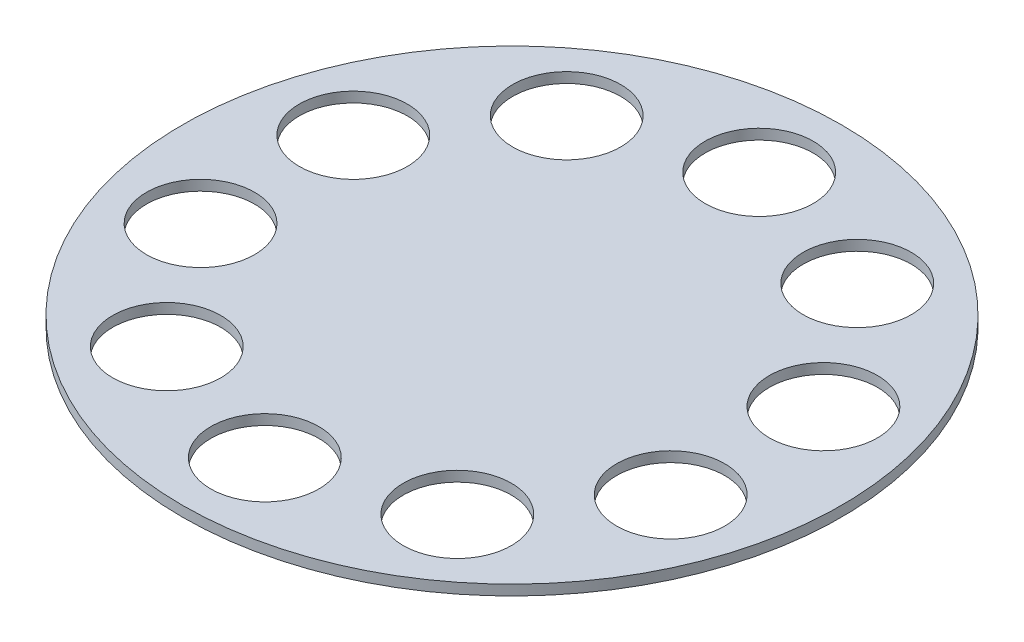
ISO-10303-21;
HEADER;
FILE_DESCRIPTION(('STEP AP214'),'2;1');
FILE_NAME('part.step','',(''),(''),'','','');
FILE_SCHEMA(('AUTOMOTIVE_DESIGN { 1 0 10303 214 1 1 1 1 }'));
ENDSEC;
DATA;
#1=APPLICATION_CONTEXT('core data for automotive mechanical design processes');
#2=APPLICATION_PROTOCOL_DEFINITION('international standard','automotive_design',2000,#1);
#3=PRODUCT_CONTEXT('',#1,'mechanical');
#4=PRODUCT('Part','Part','',(#3));
#5=PRODUCT_RELATED_PRODUCT_CATEGORY('part','',(#4));
#6=PRODUCT_DEFINITION_FORMATION('','',#4);
#7=PRODUCT_DEFINITION_CONTEXT('part definition',#1,'design');
#8=PRODUCT_DEFINITION('design','',#6,#7);
#9=PRODUCT_DEFINITION_SHAPE('','',#8);
#10=(LENGTH_UNIT() NAMED_UNIT(*) SI_UNIT(.MILLI.,.METRE.));
#11=(NAMED_UNIT(*) PLANE_ANGLE_UNIT() SI_UNIT($,.RADIAN.));
#12=(NAMED_UNIT(*) SI_UNIT($,.STERADIAN.) SOLID_ANGLE_UNIT());
#13=UNCERTAINTY_MEASURE_WITH_UNIT(LENGTH_MEASURE(1.E-05),#10,'distance_accuracy_value','');
#14=(GEOMETRIC_REPRESENTATION_CONTEXT(3) GLOBAL_UNCERTAINTY_ASSIGNED_CONTEXT((#13)) GLOBAL_UNIT_ASSIGNED_CONTEXT((#10,
#11,#12)) REPRESENTATION_CONTEXT('',''));
#15=CARTESIAN_POINT('',(0.,0.,0.));
#16=DIRECTION('',(0.,0.,1.));
#17=DIRECTION('',(1.,0.,0.));
#18=AXIS2_PLACEMENT_3D('',#15,#16,#17);
#19=CARTESIAN_POINT('',(0.,6.35,0.));
#20=DIRECTION('',(0.,-1.,0.));
#21=DIRECTION('',(0.,0.,-1.));
#22=AXIS2_PLACEMENT_3D('',#19,#20,#21);
#23=CYLINDRICAL_SURFACE('',#22,203.2);
#24=CARTESIAN_POINT('',(0.,6.35,0.));
#25=DIRECTION('',(0.,1.,0.));
#26=DIRECTION('',(0.,0.,1.));
#27=AXIS2_PLACEMENT_3D('',#24,#25,#26);
#28=CIRCLE('',#27,203.2);
#29=CARTESIAN_POINT('',(0.,6.35,203.2));
#30=VERTEX_POINT('',#29);
#31=EDGE_CURVE('E10',#30,#30,#28,.T.);
#32=ORIENTED_EDGE('',*,*,#31,.F.);
#33=EDGE_LOOP('',(#32));
#34=FACE_BOUND('',#33,.T.);
#35=CARTESIAN_POINT('',(0.,0.,0.));
#36=DIRECTION('',(0.,1.,0.));
#37=DIRECTION('',(0.,0.,1.));
#38=AXIS2_PLACEMENT_3D('',#35,#36,#37);
#39=CIRCLE('',#38,203.2);
#40=CARTESIAN_POINT('',(0.,0.,203.2));
#41=VERTEX_POINT('',#40);
#42=EDGE_CURVE('E34',#41,#41,#39,.T.);
#43=ORIENTED_EDGE('',*,*,#42,.T.);
#44=EDGE_LOOP('',(#43));
#45=FACE_BOUND('',#44,.T.);
#46=ADVANCED_FACE('F31',(#34,#45),#23,.T.);
#47=CARTESIAN_POINT('',(0.,6.35,0.));
#48=DIRECTION('',(0.,1.,0.));
#49=DIRECTION('',(0.,0.,1.));
#50=AXIS2_PLACEMENT_3D('',#47,#48,#49);
#51=PLANE('',#50);
#52=CARTESIAN_POINT('',(-89.5784724493715,6.35,-123.294189942738));
#53=DIRECTION('',(0.,1.,0.));
#54=DIRECTION('',(0.,0.,1.));
#55=AXIS2_PLACEMENT_3D('',#52,#53,#54);
#56=CIRCLE('',#55,33.3375);
#57=CARTESIAN_POINT('',(-89.5784724493715,6.35,-89.9566899427375));
#58=VERTEX_POINT('',#57);
#59=EDGE_CURVE('E97',#58,#58,#56,.T.);
#60=ORIENTED_EDGE('',*,*,#59,.F.);
#61=EDGE_LOOP('',(#60));
#62=FACE_BOUND('',#61,.T.);
#63=CARTESIAN_POINT('',(-144.941013083376,6.35,-47.0941899427348));
#64=DIRECTION('',(0.,1.,0.));
#65=DIRECTION('',(0.,0.,1.));
#66=AXIS2_PLACEMENT_3D('',#63,#64,#65);
#67=CIRCLE('',#66,33.3375);
#68=CARTESIAN_POINT('',(-144.941013083376,6.35,-13.7566899427348));
#69=VERTEX_POINT('',#68);
#70=EDGE_CURVE('E91',#69,#69,#67,.T.);
#71=ORIENTED_EDGE('',*,*,#70,.F.);
#72=EDGE_LOOP('',(#71));
#73=FACE_BOUND('',#72,.T.);
#74=CARTESIAN_POINT('',(-144.941013083372,6.35,47.0941899427492));
#75=DIRECTION('',(0.,1.,0.));
#76=DIRECTION('',(0.,0.,1.));
#77=AXIS2_PLACEMENT_3D('',#74,#75,#76);
#78=CIRCLE('',#77,33.3375);
#79=CARTESIAN_POINT('',(-144.941013083372,6.35,80.4316899427492));
#80=VERTEX_POINT('',#79);
#81=EDGE_CURVE('E85',#80,#80,#78,.T.);
#82=ORIENTED_EDGE('',*,*,#81,.F.);
#83=EDGE_LOOP('',(#82));
#84=FACE_BOUND('',#83,.T.);
#85=CARTESIAN_POINT('',(-89.5784724493593,6.35,123.294189942746));
#86=DIRECTION('',(0.,1.,0.));
#87=DIRECTION('',(0.,0.,1.));
#88=AXIS2_PLACEMENT_3D('',#85,#86,#87);
#89=CIRCLE('',#88,33.3375);
#90=CARTESIAN_POINT('',(-89.5784724493593,6.35,156.631689942746));
#91=VERTEX_POINT('',#90);
#92=EDGE_CURVE('E79',#91,#91,#89,.T.);
#93=ORIENTED_EDGE('',*,*,#92,.F.);
#94=EDGE_LOOP('',(#93));
#95=FACE_BOUND('',#94,.T.);
#96=CARTESIAN_POINT('',(1.511348076713E-11,6.35,152.4));
#97=DIRECTION('',(0.,1.,0.));
#98=DIRECTION('',(0.,0.,1.));
#99=AXIS2_PLACEMENT_3D('',#96,#97,#98);
#100=CIRCLE('',#99,33.3375);
#101=CARTESIAN_POINT('',(1.511348076713E-11,6.35,185.7375));
#102=VERTEX_POINT('',#101);
#103=EDGE_CURVE('E73',#102,#102,#100,.T.);
#104=ORIENTED_EDGE('',*,*,#103,.F.);
#105=EDGE_LOOP('',(#104));
#106=FACE_BOUND('',#105,.T.);
#107=CARTESIAN_POINT('',(89.5784724493866,6.35,123.294189942738));
#108=DIRECTION('',(0.,1.,0.));
#109=DIRECTION('',(0.,0.,1.));
#110=AXIS2_PLACEMENT_3D('',#107,#108,#109);
#111=CIRCLE('',#110,33.3375);
#112=CARTESIAN_POINT('',(89.5784724493866,6.35,156.631689942738));
#113=VERTEX_POINT('',#112);
#114=EDGE_CURVE('E67',#113,#113,#111,.T.);
#115=ORIENTED_EDGE('',*,*,#114,.F.);
#116=EDGE_LOOP('',(#115));
#117=FACE_BOUND('',#116,.T.);
#118=CARTESIAN_POINT('',(144.941013083391,6.35,47.0941899427348));
#119=DIRECTION('',(0.,1.,0.));
#120=DIRECTION('',(0.,0.,1.));
#121=AXIS2_PLACEMENT_3D('',#118,#119,#120);
#122=CIRCLE('',#121,33.3375);
#123=CARTESIAN_POINT('',(144.941013083391,6.35,80.4316899427348));
#124=VERTEX_POINT('',#123);
#125=EDGE_CURVE('E61',#124,#124,#122,.T.);
#126=ORIENTED_EDGE('',*,*,#125,.F.);
#127=EDGE_LOOP('',(#126));
#128=FACE_BOUND('',#127,.T.);
#129=CARTESIAN_POINT('',(144.941013083387,6.35,-47.0941899427492));
#130=DIRECTION('',(0.,1.,0.));
#131=DIRECTION('',(0.,0.,1.));
#132=AXIS2_PLACEMENT_3D('',#129,#130,#131);
#133=CIRCLE('',#132,33.3375);
#134=CARTESIAN_POINT('',(144.941013083387,6.35,-13.7566899427492));
#135=VERTEX_POINT('',#134);
#136=EDGE_CURVE('E55',#135,#135,#133,.T.);
#137=ORIENTED_EDGE('',*,*,#136,.F.);
#138=EDGE_LOOP('',(#137));
#139=FACE_BOUND('',#138,.T.);
#140=CARTESIAN_POINT('',(89.5784724493744,6.35,-123.294189942746));
#141=DIRECTION('',(0.,1.,0.));
#142=DIRECTION('',(0.,0.,1.));
#143=AXIS2_PLACEMENT_3D('',#140,#141,#142);
#144=CIRCLE('',#143,33.3375);
#145=CARTESIAN_POINT('',(89.5784724493744,6.35,-89.9566899427464));
#146=VERTEX_POINT('',#145);
#147=EDGE_CURVE('E49',#146,#146,#144,.T.);
#148=ORIENTED_EDGE('',*,*,#147,.F.);
#149=EDGE_LOOP('',(#148));
#150=FACE_BOUND('',#149,.T.);
#151=CARTESIAN_POINT('',(0.,6.35,-152.4));
#152=DIRECTION('',(0.,1.,0.));
#153=DIRECTION('',(0.,0.,1.));
#154=AXIS2_PLACEMENT_3D('',#151,#152,#153);
#155=CIRCLE('',#154,33.3375);
#156=CARTESIAN_POINT('',(0.,6.35,-119.0625));
#157=VERTEX_POINT('',#156);
#158=EDGE_CURVE('E43',#157,#157,#155,.T.);
#159=ORIENTED_EDGE('',*,*,#158,.F.);
#160=EDGE_LOOP('',(#159));
#161=FACE_BOUND('',#160,.T.);
#162=ORIENTED_EDGE('',*,*,#31,.T.);
#163=EDGE_LOOP('',(#162));
#164=FACE_BOUND('',#163,.T.);
#165=ADVANCED_FACE('F113',(#62,#73,#84,#95,#106,#117,#128,#139,#150,#161,#164),#51,.T.);
#166=CARTESIAN_POINT('',(0.,0.,0.));
#167=DIRECTION('',(0.,1.,0.));
#168=DIRECTION('',(0.,0.,1.));
#169=AXIS2_PLACEMENT_3D('',#166,#167,#168);
#170=PLANE('',#169);
#171=CARTESIAN_POINT('',(-89.5784724493715,0.,-123.294189942738));
#172=DIRECTION('',(0.,1.,0.));
#173=DIRECTION('',(0.,0.,1.));
#174=AXIS2_PLACEMENT_3D('',#171,#172,#173);
#175=CIRCLE('',#174,33.3375);
#176=CARTESIAN_POINT('',(-89.5784724493715,0.,-89.9566899427375));
#177=VERTEX_POINT('',#176);
#178=EDGE_CURVE('E94',#177,#177,#175,.T.);
#179=ORIENTED_EDGE('',*,*,#178,.T.);
#180=EDGE_LOOP('',(#179));
#181=FACE_BOUND('',#180,.T.);
#182=CARTESIAN_POINT('',(-144.941013083376,0.,-47.0941899427348));
#183=DIRECTION('',(0.,1.,0.));
#184=DIRECTION('',(0.,0.,1.));
#185=AXIS2_PLACEMENT_3D('',#182,#183,#184);
#186=CIRCLE('',#185,33.3375);
#187=CARTESIAN_POINT('',(-144.941013083376,0.,-13.7566899427348));
#188=VERTEX_POINT('',#187);
#189=EDGE_CURVE('E88',#188,#188,#186,.T.);
#190=ORIENTED_EDGE('',*,*,#189,.T.);
#191=EDGE_LOOP('',(#190));
#192=FACE_BOUND('',#191,.T.);
#193=CARTESIAN_POINT('',(-144.941013083372,0.,47.0941899427492));
#194=DIRECTION('',(0.,1.,0.));
#195=DIRECTION('',(0.,0.,1.));
#196=AXIS2_PLACEMENT_3D('',#193,#194,#195);
#197=CIRCLE('',#196,33.3375);
#198=CARTESIAN_POINT('',(-144.941013083372,0.,80.4316899427492));
#199=VERTEX_POINT('',#198);
#200=EDGE_CURVE('E82',#199,#199,#197,.T.);
#201=ORIENTED_EDGE('',*,*,#200,.T.);
#202=EDGE_LOOP('',(#201));
#203=FACE_BOUND('',#202,.T.);
#204=CARTESIAN_POINT('',(-89.5784724493593,0.,123.294189942746));
#205=DIRECTION('',(0.,1.,0.));
#206=DIRECTION('',(0.,0.,1.));
#207=AXIS2_PLACEMENT_3D('',#204,#205,#206);
#208=CIRCLE('',#207,33.3375);
#209=CARTESIAN_POINT('',(-89.5784724493593,0.,156.631689942746));
#210=VERTEX_POINT('',#209);
#211=EDGE_CURVE('E76',#210,#210,#208,.T.);
#212=ORIENTED_EDGE('',*,*,#211,.T.);
#213=EDGE_LOOP('',(#212));
#214=FACE_BOUND('',#213,.T.);
#215=CARTESIAN_POINT('',(1.511348076713E-11,0.,152.4));
#216=DIRECTION('',(0.,1.,0.));
#217=DIRECTION('',(0.,0.,1.));
#218=AXIS2_PLACEMENT_3D('',#215,#216,#217);
#219=CIRCLE('',#218,33.3375);
#220=CARTESIAN_POINT('',(1.511348076713E-11,0.,185.7375));
#221=VERTEX_POINT('',#220);
#222=EDGE_CURVE('E70',#221,#221,#219,.T.);
#223=ORIENTED_EDGE('',*,*,#222,.T.);
#224=EDGE_LOOP('',(#223));
#225=FACE_BOUND('',#224,.T.);
#226=CARTESIAN_POINT('',(89.5784724493866,0.,123.294189942738));
#227=DIRECTION('',(0.,1.,0.));
#228=DIRECTION('',(0.,0.,1.));
#229=AXIS2_PLACEMENT_3D('',#226,#227,#228);
#230=CIRCLE('',#229,33.3375);
#231=CARTESIAN_POINT('',(89.5784724493866,0.,156.631689942738));
#232=VERTEX_POINT('',#231);
#233=EDGE_CURVE('E64',#232,#232,#230,.T.);
#234=ORIENTED_EDGE('',*,*,#233,.T.);
#235=EDGE_LOOP('',(#234));
#236=FACE_BOUND('',#235,.T.);
#237=CARTESIAN_POINT('',(144.941013083391,0.,47.0941899427348));
#238=DIRECTION('',(0.,1.,0.));
#239=DIRECTION('',(0.,0.,1.));
#240=AXIS2_PLACEMENT_3D('',#237,#238,#239);
#241=CIRCLE('',#240,33.3375);
#242=CARTESIAN_POINT('',(144.941013083391,0.,80.4316899427348));
#243=VERTEX_POINT('',#242);
#244=EDGE_CURVE('E58',#243,#243,#241,.T.);
#245=ORIENTED_EDGE('',*,*,#244,.T.);
#246=EDGE_LOOP('',(#245));
#247=FACE_BOUND('',#246,.T.);
#248=CARTESIAN_POINT('',(144.941013083387,0.,-47.0941899427492));
#249=DIRECTION('',(0.,1.,0.));
#250=DIRECTION('',(0.,0.,1.));
#251=AXIS2_PLACEMENT_3D('',#248,#249,#250);
#252=CIRCLE('',#251,33.3375);
#253=CARTESIAN_POINT('',(144.941013083387,0.,-13.7566899427492));
#254=VERTEX_POINT('',#253);
#255=EDGE_CURVE('E52',#254,#254,#252,.T.);
#256=ORIENTED_EDGE('',*,*,#255,.T.);
#257=EDGE_LOOP('',(#256));
#258=FACE_BOUND('',#257,.T.);
#259=CARTESIAN_POINT('',(89.5784724493744,0.,-123.294189942746));
#260=DIRECTION('',(0.,1.,0.));
#261=DIRECTION('',(0.,0.,1.));
#262=AXIS2_PLACEMENT_3D('',#259,#260,#261);
#263=CIRCLE('',#262,33.3375);
#264=CARTESIAN_POINT('',(89.5784724493744,0.,-89.9566899427464));
#265=VERTEX_POINT('',#264);
#266=EDGE_CURVE('E46',#265,#265,#263,.T.);
#267=ORIENTED_EDGE('',*,*,#266,.T.);
#268=EDGE_LOOP('',(#267));
#269=FACE_BOUND('',#268,.T.);
#270=CARTESIAN_POINT('',(0.,0.,-152.4));
#271=DIRECTION('',(0.,1.,0.));
#272=DIRECTION('',(0.,0.,1.));
#273=AXIS2_PLACEMENT_3D('',#270,#271,#272);
#274=CIRCLE('',#273,33.3375);
#275=CARTESIAN_POINT('',(0.,0.,-119.0625));
#276=VERTEX_POINT('',#275);
#277=EDGE_CURVE('E41',#276,#276,#274,.T.);
#278=ORIENTED_EDGE('',*,*,#277,.T.);
#279=EDGE_LOOP('',(#278));
#280=FACE_BOUND('',#279,.T.);
#281=ORIENTED_EDGE('',*,*,#42,.F.);
#282=EDGE_LOOP('',(#281));
#283=FACE_BOUND('',#282,.T.);
#284=ADVANCED_FACE('F103',(#181,#192,#203,#214,#225,#236,#247,#258,#269,#280,#283),#170,.F.);
#285=CARTESIAN_POINT('',(0.,0.,-152.4));
#286=DIRECTION('',(0.,1.,0.));
#287=DIRECTION('',(0.,0.,1.));
#288=AXIS2_PLACEMENT_3D('',#285,#286,#287);
#289=CYLINDRICAL_SURFACE('',#288,33.3375);
#290=ORIENTED_EDGE('',*,*,#277,.F.);
#291=EDGE_LOOP('',(#290));
#292=FACE_BOUND('',#291,.T.);
#293=ORIENTED_EDGE('',*,*,#158,.T.);
#294=EDGE_LOOP('',(#293));
#295=FACE_BOUND('',#294,.T.);
#296=ADVANCED_FACE('F135',(#292,#295),#289,.F.);
#297=CARTESIAN_POINT('',(89.5784724493744,0.,-123.294189942746));
#298=DIRECTION('',(0.,1.,0.));
#299=DIRECTION('',(0.,0.,1.));
#300=AXIS2_PLACEMENT_3D('',#297,#298,#299);
#301=CYLINDRICAL_SURFACE('',#300,33.3375);
#302=ORIENTED_EDGE('',*,*,#266,.F.);
#303=EDGE_LOOP('',(#302));
#304=FACE_BOUND('',#303,.T.);
#305=ORIENTED_EDGE('',*,*,#147,.T.);
#306=EDGE_LOOP('',(#305));
#307=FACE_BOUND('',#306,.T.);
#308=ADVANCED_FACE('F137',(#304,#307),#301,.F.);
#309=CARTESIAN_POINT('',(144.941013083387,0.,-47.0941899427492));
#310=DIRECTION('',(0.,1.,0.));
#311=DIRECTION('',(0.,0.,1.));
#312=AXIS2_PLACEMENT_3D('',#309,#310,#311);
#313=CYLINDRICAL_SURFACE('',#312,33.3375);
#314=ORIENTED_EDGE('',*,*,#255,.F.);
#315=EDGE_LOOP('',(#314));
#316=FACE_BOUND('',#315,.T.);
#317=ORIENTED_EDGE('',*,*,#136,.T.);
#318=EDGE_LOOP('',(#317));
#319=FACE_BOUND('',#318,.T.);
#320=ADVANCED_FACE('F144',(#316,#319),#313,.F.);
#321=CARTESIAN_POINT('',(144.941013083391,0.,47.0941899427348));
#322=DIRECTION('',(0.,1.,0.));
#323=DIRECTION('',(0.,0.,1.));
#324=AXIS2_PLACEMENT_3D('',#321,#322,#323);
#325=CYLINDRICAL_SURFACE('',#324,33.3375);
#326=ORIENTED_EDGE('',*,*,#244,.F.);
#327=EDGE_LOOP('',(#326));
#328=FACE_BOUND('',#327,.T.);
#329=ORIENTED_EDGE('',*,*,#125,.T.);
#330=EDGE_LOOP('',(#329));
#331=FACE_BOUND('',#330,.T.);
#332=ADVANCED_FACE('F182',(#328,#331),#325,.F.);
#333=CARTESIAN_POINT('',(89.5784724493866,0.,123.294189942738));
#334=DIRECTION('',(0.,1.,0.));
#335=DIRECTION('',(0.,0.,1.));
#336=AXIS2_PLACEMENT_3D('',#333,#334,#335);
#337=CYLINDRICAL_SURFACE('',#336,33.3375);
#338=ORIENTED_EDGE('',*,*,#233,.F.);
#339=EDGE_LOOP('',(#338));
#340=FACE_BOUND('',#339,.T.);
#341=ORIENTED_EDGE('',*,*,#114,.T.);
#342=EDGE_LOOP('',(#341));
#343=FACE_BOUND('',#342,.T.);
#344=ADVANCED_FACE('F192',(#340,#343),#337,.F.);
#345=CARTESIAN_POINT('',(1.511348076713E-11,0.,152.4));
#346=DIRECTION('',(0.,1.,0.));
#347=DIRECTION('',(0.,0.,1.));
#348=AXIS2_PLACEMENT_3D('',#345,#346,#347);
#349=CYLINDRICAL_SURFACE('',#348,33.3375);
#350=ORIENTED_EDGE('',*,*,#222,.F.);
#351=EDGE_LOOP('',(#350));
#352=FACE_BOUND('',#351,.T.);
#353=ORIENTED_EDGE('',*,*,#103,.T.);
#354=EDGE_LOOP('',(#353));
#355=FACE_BOUND('',#354,.T.);
#356=ADVANCED_FACE('F202',(#352,#355),#349,.F.);
#357=CARTESIAN_POINT('',(-89.5784724493593,0.,123.294189942746));
#358=DIRECTION('',(0.,1.,0.));
#359=DIRECTION('',(0.,0.,1.));
#360=AXIS2_PLACEMENT_3D('',#357,#358,#359);
#361=CYLINDRICAL_SURFACE('',#360,33.3375);
#362=ORIENTED_EDGE('',*,*,#211,.F.);
#363=EDGE_LOOP('',(#362));
#364=FACE_BOUND('',#363,.T.);
#365=ORIENTED_EDGE('',*,*,#92,.T.);
#366=EDGE_LOOP('',(#365));
#367=FACE_BOUND('',#366,.T.);
#368=ADVANCED_FACE('F212',(#364,#367),#361,.F.);
#369=CARTESIAN_POINT('',(-144.941013083372,0.,47.0941899427492));
#370=DIRECTION('',(0.,1.,0.));
#371=DIRECTION('',(0.,0.,1.));
#372=AXIS2_PLACEMENT_3D('',#369,#370,#371);
#373=CYLINDRICAL_SURFACE('',#372,33.3375);
#374=ORIENTED_EDGE('',*,*,#200,.F.);
#375=EDGE_LOOP('',(#374));
#376=FACE_BOUND('',#375,.T.);
#377=ORIENTED_EDGE('',*,*,#81,.T.);
#378=EDGE_LOOP('',(#377));
#379=FACE_BOUND('',#378,.T.);
#380=ADVANCED_FACE('F222',(#376,#379),#373,.F.);
#381=CARTESIAN_POINT('',(-144.941013083376,0.,-47.0941899427348));
#382=DIRECTION('',(0.,1.,0.));
#383=DIRECTION('',(0.,0.,1.));
#384=AXIS2_PLACEMENT_3D('',#381,#382,#383);
#385=CYLINDRICAL_SURFACE('',#384,33.3375);
#386=ORIENTED_EDGE('',*,*,#189,.F.);
#387=EDGE_LOOP('',(#386));
#388=FACE_BOUND('',#387,.T.);
#389=ORIENTED_EDGE('',*,*,#70,.T.);
#390=EDGE_LOOP('',(#389));
#391=FACE_BOUND('',#390,.T.);
#392=ADVANCED_FACE('F109',(#388,#391),#385,.F.);
#393=CARTESIAN_POINT('',(-89.5784724493715,0.,-123.294189942738));
#394=DIRECTION('',(0.,1.,0.));
#395=DIRECTION('',(0.,0.,1.));
#396=AXIS2_PLACEMENT_3D('',#393,#394,#395);
#397=CYLINDRICAL_SURFACE('',#396,33.3375);
#398=ORIENTED_EDGE('',*,*,#178,.F.);
#399=EDGE_LOOP('',(#398));
#400=FACE_BOUND('',#399,.T.);
#401=ORIENTED_EDGE('',*,*,#59,.T.);
#402=EDGE_LOOP('',(#401));
#403=FACE_BOUND('',#402,.T.);
#404=ADVANCED_FACE('F106',(#400,#403),#397,.F.);
#405=CLOSED_SHELL('',(#46,#165,#284,#296,#308,#320,#332,#344,#356,#368,#380,#392,#404));
#406=MANIFOLD_SOLID_BREP('B2',#405);
#407=ADVANCED_BREP_SHAPE_REPRESENTATION('',(#18,#406),#14);
#408=SHAPE_DEFINITION_REPRESENTATION(#9,#407);
ENDSEC;
END-ISO-10303-21;
